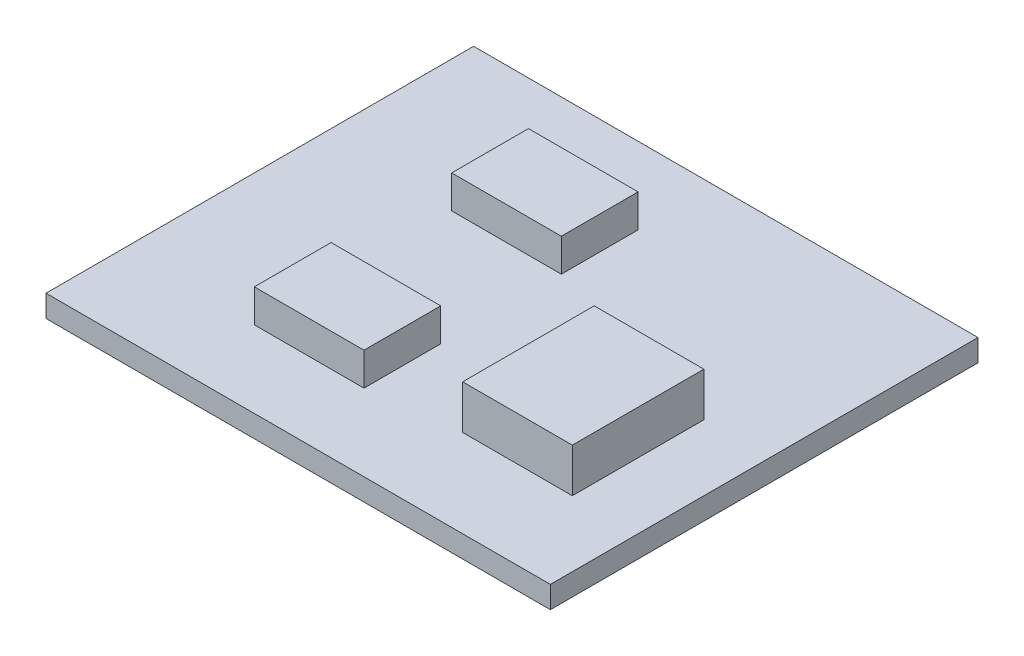
ISO-10303-21;
HEADER;
FILE_DESCRIPTION(('STEP AP214'),'2;1');
FILE_NAME('part.step','',(''),(''),'','','');
FILE_SCHEMA(('AUTOMOTIVE_DESIGN { 1 0 10303 214 1 1 1 1 }'));
ENDSEC;
DATA;
#1=APPLICATION_CONTEXT('core data for automotive mechanical design processes');
#2=APPLICATION_PROTOCOL_DEFINITION('international standard','automotive_design',2000,#1);
#3=PRODUCT_CONTEXT('',#1,'mechanical');
#4=PRODUCT('Part','Part','',(#3));
#5=PRODUCT_RELATED_PRODUCT_CATEGORY('part','',(#4));
#6=PRODUCT_DEFINITION_FORMATION('','',#4);
#7=PRODUCT_DEFINITION_CONTEXT('part definition',#1,'design');
#8=PRODUCT_DEFINITION('design','',#6,#7);
#9=PRODUCT_DEFINITION_SHAPE('','',#8);
#10=(LENGTH_UNIT() NAMED_UNIT(*) SI_UNIT(.MILLI.,.METRE.));
#11=(NAMED_UNIT(*) PLANE_ANGLE_UNIT() SI_UNIT($,.RADIAN.));
#12=(NAMED_UNIT(*) SI_UNIT($,.STERADIAN.) SOLID_ANGLE_UNIT());
#13=UNCERTAINTY_MEASURE_WITH_UNIT(LENGTH_MEASURE(1.E-05),#10,'distance_accuracy_value','');
#14=(GEOMETRIC_REPRESENTATION_CONTEXT(3) GLOBAL_UNCERTAINTY_ASSIGNED_CONTEXT((#13)) GLOBAL_UNIT_ASSIGNED_CONTEXT((#10,
#11,#12)) REPRESENTATION_CONTEXT('',''));
#15=CARTESIAN_POINT('',(0.,0.,0.));
#16=DIRECTION('',(0.,0.,1.));
#17=DIRECTION('',(1.,0.,0.));
#18=AXIS2_PLACEMENT_3D('',#15,#16,#17);
#19=CARTESIAN_POINT('',(0.,0.,0.));
#20=DIRECTION('',(0.,-1.,0.));
#21=DIRECTION('',(0.,0.,-1.));
#22=AXIS2_PLACEMENT_3D('',#19,#20,#21);
#23=PLANE('',#22);
#24=DIRECTION('',(0.,0.,1.));
#25=VECTOR('',#24,1.);
#26=CARTESIAN_POINT('',(6.,0.,-7.));
#27=LINE('',#26,#25);
#28=CARTESIAN_POINT('',(6.,0.,-7.));
#29=VERTEX_POINT('',#28);
#30=CARTESIAN_POINT('',(6.,0.,-3.5));
#31=VERTEX_POINT('',#30);
#32=EDGE_CURVE('E300',#29,#31,#27,.T.);
#33=ORIENTED_EDGE('',*,*,#32,.T.);
#34=DIRECTION('',(1.,0.,0.));
#35=VECTOR('',#34,1.);
#36=CARTESIAN_POINT('',(6.,0.,-3.5));
#37=LINE('',#36,#35);
#38=CARTESIAN_POINT('',(11.,0.,-3.5));
#39=VERTEX_POINT('',#38);
#40=EDGE_CURVE('E305',#31,#39,#37,.T.);
#41=ORIENTED_EDGE('',*,*,#40,.T.);
#42=DIRECTION('',(0.,0.,-1.));
#43=VECTOR('',#42,1.);
#44=CARTESIAN_POINT('',(11.,0.,-7.));
#45=LINE('',#44,#43);
#46=CARTESIAN_POINT('',(11.,0.,-7.));
#47=VERTEX_POINT('',#46);
#48=EDGE_CURVE('E318',#39,#47,#45,.T.);
#49=ORIENTED_EDGE('',*,*,#48,.T.);
#50=DIRECTION('',(-1.,0.,0.));
#51=VECTOR('',#50,1.);
#52=CARTESIAN_POINT('',(6.,0.,-7.));
#53=LINE('',#52,#51);
#54=EDGE_CURVE('E316',#47,#29,#53,.T.);
#55=ORIENTED_EDGE('',*,*,#54,.T.);
#56=EDGE_LOOP('',(#33,#41,#49,#55));
#57=FACE_BOUND('',#56,.T.);
#58=DIRECTION('',(0.,0.,1.));
#59=VECTOR('',#58,1.);
#60=CARTESIAN_POINT('',(6.,0.,-16.));
#61=LINE('',#60,#59);
#62=CARTESIAN_POINT('',(6.,0.,-16.));
#63=VERTEX_POINT('',#62);
#64=CARTESIAN_POINT('',(6.,0.,-12.5));
#65=VERTEX_POINT('',#64);
#66=EDGE_CURVE('E332',#63,#65,#61,.T.);
#67=ORIENTED_EDGE('',*,*,#66,.T.);
#68=DIRECTION('',(1.,0.,0.));
#69=VECTOR('',#68,1.);
#70=CARTESIAN_POINT('',(6.,0.,-12.5));
#71=LINE('',#70,#69);
#72=CARTESIAN_POINT('',(11.,0.,-12.5));
#73=VERTEX_POINT('',#72);
#74=EDGE_CURVE('E337',#65,#73,#71,.T.);
#75=ORIENTED_EDGE('',*,*,#74,.T.);
#76=DIRECTION('',(0.,0.,-1.));
#77=VECTOR('',#76,1.);
#78=CARTESIAN_POINT('',(11.,0.,-16.));
#79=LINE('',#78,#77);
#80=CARTESIAN_POINT('',(11.,0.,-16.));
#81=VERTEX_POINT('',#80);
#82=EDGE_CURVE('E350',#73,#81,#79,.T.);
#83=ORIENTED_EDGE('',*,*,#82,.T.);
#84=DIRECTION('',(-1.,0.,0.));
#85=VECTOR('',#84,1.);
#86=CARTESIAN_POINT('',(6.,0.,-16.));
#87=LINE('',#86,#85);
#88=EDGE_CURVE('E348',#81,#63,#87,.T.);
#89=ORIENTED_EDGE('',*,*,#88,.T.);
#90=EDGE_LOOP('',(#67,#75,#83,#89));
#91=FACE_BOUND('',#90,.T.);
#92=DIRECTION('',(0.,0.,1.));
#93=VECTOR('',#92,1.);
#94=CARTESIAN_POINT('',(0.,0.,0.));
#95=LINE('',#94,#93);
#96=CARTESIAN_POINT('',(0.,0.,-19.5));
#97=VERTEX_POINT('',#96);
#98=CARTESIAN_POINT('',(0.,0.,0.));
#99=VERTEX_POINT('',#98);
#100=EDGE_CURVE('E463',#97,#99,#95,.T.);
#101=ORIENTED_EDGE('',*,*,#100,.F.);
#102=DIRECTION('',(-1.,0.,0.));
#103=VECTOR('',#102,1.);
#104=CARTESIAN_POINT('',(0.,0.,-19.5));
#105=LINE('',#104,#103);
#106=CARTESIAN_POINT('',(23.,0.,-19.5));
#107=VERTEX_POINT('',#106);
#108=EDGE_CURVE('E468',#107,#97,#105,.T.);
#109=ORIENTED_EDGE('',*,*,#108,.F.);
#110=DIRECTION('',(0.,0.,-1.));
#111=VECTOR('',#110,1.);
#112=CARTESIAN_POINT('',(23.,0.,0.));
#113=LINE('',#112,#111);
#114=CARTESIAN_POINT('',(23.,0.,0.));
#115=VERTEX_POINT('',#114);
#116=EDGE_CURVE('E479',#115,#107,#113,.T.);
#117=ORIENTED_EDGE('',*,*,#116,.F.);
#118=DIRECTION('',(1.,0.,0.));
#119=VECTOR('',#118,1.);
#120=CARTESIAN_POINT('',(0.,0.,0.));
#121=LINE('',#120,#119);
#122=EDGE_CURVE('E477',#99,#115,#121,.T.);
#123=ORIENTED_EDGE('',*,*,#122,.F.);
#124=EDGE_LOOP('',(#101,#109,#117,#123));
#125=FACE_BOUND('',#124,.T.);
#126=DIRECTION('',(-1.,0.,0.));
#127=VECTOR('',#126,1.);
#128=CARTESIAN_POINT('',(18.5,0.,-7.5));
#129=LINE('',#128,#127);
#130=CARTESIAN_POINT('',(18.5,0.,-7.5));
#131=VERTEX_POINT('',#130);
#132=CARTESIAN_POINT('',(16.,0.,-7.5));
#133=VERTEX_POINT('',#132);
#134=EDGE_CURVE('E272',#131,#133,#129,.T.);
#135=ORIENTED_EDGE('',*,*,#134,.F.);
#136=DIRECTION('',(0.,0.,1.));
#137=VECTOR('',#136,1.);
#138=CARTESIAN_POINT('',(18.5,0.,-9.));
#139=LINE('',#138,#137);
#140=CARTESIAN_POINT('',(18.5,0.,-9.));
#141=VERTEX_POINT('',#140);
#142=EDGE_CURVE('E269',#141,#131,#139,.T.);
#143=ORIENTED_EDGE('',*,*,#142,.F.);
#144=DIRECTION('',(1.,0.,0.));
#145=VECTOR('',#144,1.);
#146=CARTESIAN_POINT('',(18.5,0.,-9.));
#147=LINE('',#146,#145);
#148=CARTESIAN_POINT('',(16.,0.,-9.));
#149=VERTEX_POINT('',#148);
#150=EDGE_CURVE('E281',#149,#141,#147,.T.);
#151=ORIENTED_EDGE('',*,*,#150,.F.);
#152=DIRECTION('',(0.,0.,-1.));
#153=VECTOR('',#152,1.);
#154=CARTESIAN_POINT('',(16.,0.,-9.));
#155=LINE('',#154,#153);
#156=EDGE_CURVE('E289',#133,#149,#155,.T.);
#157=ORIENTED_EDGE('',*,*,#156,.F.);
#158=EDGE_LOOP('',(#135,#143,#151,#157));
#159=FACE_BOUND('',#158,.T.);
#160=DIRECTION('',(-1.,0.,0.));
#161=VECTOR('',#160,1.);
#162=CARTESIAN_POINT('',(18.5,0.,-4.5));
#163=LINE('',#162,#161);
#164=CARTESIAN_POINT('',(18.5,0.,-4.5));
#165=VERTEX_POINT('',#164);
#166=CARTESIAN_POINT('',(16.,0.,-4.5));
#167=VERTEX_POINT('',#166);
#168=EDGE_CURVE('E907',#165,#167,#163,.T.);
#169=ORIENTED_EDGE('',*,*,#168,.F.);
#170=DIRECTION('',(0.,0.,1.));
#171=VECTOR('',#170,1.);
#172=CARTESIAN_POINT('',(18.5,0.,-6.));
#173=LINE('',#172,#171);
#174=CARTESIAN_POINT('',(18.5,0.,-6.));
#175=VERTEX_POINT('',#174);
#176=EDGE_CURVE('E267',#175,#165,#173,.T.);
#177=ORIENTED_EDGE('',*,*,#176,.F.);
#178=DIRECTION('',(1.,0.,0.));
#179=VECTOR('',#178,1.);
#180=CARTESIAN_POINT('',(18.5,0.,-6.));
#181=LINE('',#180,#179);
#182=CARTESIAN_POINT('',(16.,0.,-6.));
#183=VERTEX_POINT('',#182);
#184=EDGE_CURVE('E263',#183,#175,#181,.T.);
#185=ORIENTED_EDGE('',*,*,#184,.F.);
#186=DIRECTION('',(0.,0.,-1.));
#187=VECTOR('',#186,1.);
#188=CARTESIAN_POINT('',(16.,0.,-6.));
#189=LINE('',#188,#187);
#190=EDGE_CURVE('E904',#167,#183,#189,.T.);
#191=ORIENTED_EDGE('',*,*,#190,.F.);
#192=EDGE_LOOP('',(#169,#177,#185,#191));
#193=FACE_BOUND('',#192,.T.);
#194=ADVANCED_FACE('F34',(#57,#91,#125,#159,#193),#23,.T.);
#195=CARTESIAN_POINT('',(0.,1.,0.));
#196=DIRECTION('',(0.,-1.,0.));
#197=DIRECTION('',(0.,0.,-1.));
#198=AXIS2_PLACEMENT_3D('',#195,#196,#197);
#199=PLANE('',#198);
#200=DIRECTION('',(0.,0.,1.));
#201=VECTOR('',#200,1.);
#202=CARTESIAN_POINT('',(6.,1.,-16.));
#203=LINE('',#202,#201);
#204=CARTESIAN_POINT('',(6.,1.,-16.));
#205=VERTEX_POINT('',#204);
#206=CARTESIAN_POINT('',(6.,1.,-12.5));
#207=VERTEX_POINT('',#206);
#208=EDGE_CURVE('E397',#205,#207,#203,.T.);
#209=ORIENTED_EDGE('',*,*,#208,.F.);
#210=DIRECTION('',(-1.,0.,0.));
#211=VECTOR('',#210,1.);
#212=CARTESIAN_POINT('',(6.,1.,-16.));
#213=LINE('',#212,#211);
#214=CARTESIAN_POINT('',(11.,1.,-16.));
#215=VERTEX_POINT('',#214);
#216=EDGE_CURVE('E402',#215,#205,#213,.T.);
#217=ORIENTED_EDGE('',*,*,#216,.F.);
#218=DIRECTION('',(0.,0.,-1.));
#219=VECTOR('',#218,1.);
#220=CARTESIAN_POINT('',(11.,1.,-16.));
#221=LINE('',#220,#219);
#222=CARTESIAN_POINT('',(11.,1.,-12.5));
#223=VERTEX_POINT('',#222);
#224=EDGE_CURVE('E414',#223,#215,#221,.T.);
#225=ORIENTED_EDGE('',*,*,#224,.F.);
#226=DIRECTION('',(1.,0.,0.));
#227=VECTOR('',#226,1.);
#228=CARTESIAN_POINT('',(6.,1.,-12.5));
#229=LINE('',#228,#227);
#230=EDGE_CURVE('E411',#207,#223,#229,.T.);
#231=ORIENTED_EDGE('',*,*,#230,.F.);
#232=EDGE_LOOP('',(#209,#217,#225,#231));
#233=FACE_BOUND('',#232,.T.);
#234=DIRECTION('',(0.,0.,1.));
#235=VECTOR('',#234,1.);
#236=CARTESIAN_POINT('',(0.,1.,0.));
#237=LINE('',#236,#235);
#238=CARTESIAN_POINT('',(0.,1.,-19.5));
#239=VERTEX_POINT('',#238);
#240=CARTESIAN_POINT('',(0.,1.,0.));
#241=VERTEX_POINT('',#240);
#242=EDGE_CURVE('E464',#239,#241,#237,.T.);
#243=ORIENTED_EDGE('',*,*,#242,.T.);
#244=DIRECTION('',(1.,0.,0.));
#245=VECTOR('',#244,1.);
#246=CARTESIAN_POINT('',(0.,1.,0.));
#247=LINE('',#246,#245);
#248=CARTESIAN_POINT('',(23.,1.,0.));
#249=VERTEX_POINT('',#248);
#250=EDGE_CURVE('E467',#241,#249,#247,.T.);
#251=ORIENTED_EDGE('',*,*,#250,.T.);
#252=DIRECTION('',(0.,0.,-1.));
#253=VECTOR('',#252,1.);
#254=CARTESIAN_POINT('',(23.,1.,0.));
#255=LINE('',#254,#253);
#256=CARTESIAN_POINT('',(23.,1.,-19.5));
#257=VERTEX_POINT('',#256);
#258=EDGE_CURVE('E470',#249,#257,#255,.T.);
#259=ORIENTED_EDGE('',*,*,#258,.T.);
#260=DIRECTION('',(-1.,0.,0.));
#261=VECTOR('',#260,1.);
#262=CARTESIAN_POINT('',(0.,1.,-19.5));
#263=LINE('',#262,#261);
#264=EDGE_CURVE('E472',#257,#239,#263,.T.);
#265=ORIENTED_EDGE('',*,*,#264,.T.);
#266=EDGE_LOOP('',(#243,#251,#259,#265));
#267=FACE_BOUND('',#266,.T.);
#268=DIRECTION('',(0.,0.,1.));
#269=VECTOR('',#268,1.);
#270=CARTESIAN_POINT('',(15.,1.,-10.));
#271=LINE('',#270,#269);
#272=CARTESIAN_POINT('',(15.,1.,-10.));
#273=VERTEX_POINT('',#272);
#274=CARTESIAN_POINT('',(15.,1.,-4.));
#275=VERTEX_POINT('',#274);
#276=EDGE_CURVE('E430',#273,#275,#271,.T.);
#277=ORIENTED_EDGE('',*,*,#276,.F.);
#278=DIRECTION('',(-1.,0.,0.));
#279=VECTOR('',#278,1.);
#280=CARTESIAN_POINT('',(15.,1.,-10.));
#281=LINE('',#280,#279);
#282=CARTESIAN_POINT('',(20.,1.,-10.));
#283=VERTEX_POINT('',#282);
#284=EDGE_CURVE('E435',#283,#273,#281,.T.);
#285=ORIENTED_EDGE('',*,*,#284,.F.);
#286=DIRECTION('',(0.,0.,-1.));
#287=VECTOR('',#286,1.);
#288=CARTESIAN_POINT('',(20.,1.,-10.));
#289=LINE('',#288,#287);
#290=CARTESIAN_POINT('',(20.,1.,-4.));
#291=VERTEX_POINT('',#290);
#292=EDGE_CURVE('E447',#291,#283,#289,.T.);
#293=ORIENTED_EDGE('',*,*,#292,.F.);
#294=DIRECTION('',(1.,0.,0.));
#295=VECTOR('',#294,1.);
#296=CARTESIAN_POINT('',(15.,1.,-4.));
#297=LINE('',#296,#295);
#298=EDGE_CURVE('E444',#275,#291,#297,.T.);
#299=ORIENTED_EDGE('',*,*,#298,.F.);
#300=EDGE_LOOP('',(#277,#285,#293,#299));
#301=FACE_BOUND('',#300,.T.);
#302=DIRECTION('',(0.,0.,1.));
#303=VECTOR('',#302,1.);
#304=CARTESIAN_POINT('',(6.,1.,-7.));
#305=LINE('',#304,#303);
#306=CARTESIAN_POINT('',(6.,1.,-7.));
#307=VERTEX_POINT('',#306);
#308=CARTESIAN_POINT('',(6.,1.,-3.5));
#309=VERTEX_POINT('',#308);
#310=EDGE_CURVE('E364',#307,#309,#305,.T.);
#311=ORIENTED_EDGE('',*,*,#310,.F.);
#312=DIRECTION('',(-1.,0.,0.));
#313=VECTOR('',#312,1.);
#314=CARTESIAN_POINT('',(6.,1.,-7.));
#315=LINE('',#314,#313);
#316=CARTESIAN_POINT('',(11.,1.,-7.));
#317=VERTEX_POINT('',#316);
#318=EDGE_CURVE('E369',#317,#307,#315,.T.);
#319=ORIENTED_EDGE('',*,*,#318,.F.);
#320=DIRECTION('',(0.,0.,-1.));
#321=VECTOR('',#320,1.);
#322=CARTESIAN_POINT('',(11.,1.,-7.));
#323=LINE('',#322,#321);
#324=CARTESIAN_POINT('',(11.,1.,-3.5));
#325=VERTEX_POINT('',#324);
#326=EDGE_CURVE('E381',#325,#317,#323,.T.);
#327=ORIENTED_EDGE('',*,*,#326,.F.);
#328=DIRECTION('',(1.,0.,0.));
#329=VECTOR('',#328,1.);
#330=CARTESIAN_POINT('',(6.,1.,-3.5));
#331=LINE('',#330,#329);
#332=EDGE_CURVE('E378',#309,#325,#331,.T.);
#333=ORIENTED_EDGE('',*,*,#332,.F.);
#334=EDGE_LOOP('',(#311,#319,#327,#333));
#335=FACE_BOUND('',#334,.T.);
#336=ADVANCED_FACE('F506',(#233,#267,#301,#335),#199,.F.);
#337=CARTESIAN_POINT('',(0.,1.,0.));
#338=DIRECTION('',(1.,0.,0.));
#339=DIRECTION('',(0.,0.,-1.));
#340=AXIS2_PLACEMENT_3D('',#337,#338,#339);
#341=PLANE('',#340);
#342=ORIENTED_EDGE('',*,*,#100,.T.);
#343=DIRECTION('',(0.,-1.,0.));
#344=VECTOR('',#343,1.);
#345=CARTESIAN_POINT('',(0.,1.,0.));
#346=LINE('',#345,#344);
#347=EDGE_CURVE('E11',#241,#99,#346,.T.);
#348=ORIENTED_EDGE('',*,*,#347,.F.);
#349=ORIENTED_EDGE('',*,*,#242,.F.);
#350=DIRECTION('',(0.,-1.,0.));
#351=VECTOR('',#350,1.);
#352=CARTESIAN_POINT('',(0.,1.,-19.5));
#353=LINE('',#352,#351);
#354=EDGE_CURVE('E474',#239,#97,#353,.T.);
#355=ORIENTED_EDGE('',*,*,#354,.T.);
#356=EDGE_LOOP('',(#342,#348,#349,#355));
#357=FACE_BOUND('',#356,.T.);
#358=ADVANCED_FACE('F36',(#357),#341,.F.);
#359=CARTESIAN_POINT('',(0.,1.,0.));
#360=DIRECTION('',(0.,0.,-1.));
#361=DIRECTION('',(-1.,0.,0.));
#362=AXIS2_PLACEMENT_3D('',#359,#360,#361);
#363=PLANE('',#362);
#364=ORIENTED_EDGE('',*,*,#122,.T.);
#365=DIRECTION('',(0.,-1.,0.));
#366=VECTOR('',#365,1.);
#367=CARTESIAN_POINT('',(23.,1.,0.));
#368=LINE('',#367,#366);
#369=EDGE_CURVE('E42',#249,#115,#368,.T.);
#370=ORIENTED_EDGE('',*,*,#369,.F.);
#371=ORIENTED_EDGE('',*,*,#250,.F.);
#372=ORIENTED_EDGE('',*,*,#347,.T.);
#373=EDGE_LOOP('',(#364,#370,#371,#372));
#374=FACE_BOUND('',#373,.T.);
#375=ADVANCED_FACE('F508',(#374),#363,.F.);
#376=CARTESIAN_POINT('',(23.,1.,0.));
#377=DIRECTION('',(-1.,0.,0.));
#378=DIRECTION('',(0.,0.,1.));
#379=AXIS2_PLACEMENT_3D('',#376,#377,#378);
#380=PLANE('',#379);
#381=ORIENTED_EDGE('',*,*,#116,.T.);
#382=DIRECTION('',(0.,-1.,0.));
#383=VECTOR('',#382,1.);
#384=CARTESIAN_POINT('',(23.,1.,-19.5));
#385=LINE('',#384,#383);
#386=EDGE_CURVE('E484',#257,#107,#385,.T.);
#387=ORIENTED_EDGE('',*,*,#386,.F.);
#388=ORIENTED_EDGE('',*,*,#258,.F.);
#389=ORIENTED_EDGE('',*,*,#369,.T.);
#390=EDGE_LOOP('',(#381,#387,#388,#389));
#391=FACE_BOUND('',#390,.T.);
#392=ADVANCED_FACE('F491',(#391),#380,.F.);
#393=CARTESIAN_POINT('',(0.,1.,-19.5));
#394=DIRECTION('',(0.,0.,1.));
#395=DIRECTION('',(1.,0.,0.));
#396=AXIS2_PLACEMENT_3D('',#393,#394,#395);
#397=PLANE('',#396);
#398=ORIENTED_EDGE('',*,*,#108,.T.);
#399=ORIENTED_EDGE('',*,*,#354,.F.);
#400=ORIENTED_EDGE('',*,*,#264,.F.);
#401=ORIENTED_EDGE('',*,*,#386,.T.);
#402=EDGE_LOOP('',(#398,#399,#400,#401));
#403=FACE_BOUND('',#402,.T.);
#404=ADVANCED_FACE('F500',(#403),#397,.F.);
#405=CARTESIAN_POINT('',(15.,3.,-10.));
#406=DIRECTION('',(1.,0.,0.));
#407=DIRECTION('',(0.,0.,-1.));
#408=AXIS2_PLACEMENT_3D('',#405,#406,#407);
#409=PLANE('',#408);
#410=ORIENTED_EDGE('',*,*,#276,.T.);
#411=DIRECTION('',(0.,-1.,0.));
#412=VECTOR('',#411,1.);
#413=CARTESIAN_POINT('',(15.,3.,-4.));
#414=LINE('',#413,#412);
#415=CARTESIAN_POINT('',(15.,3.,-4.));
#416=VERTEX_POINT('',#415);
#417=EDGE_CURVE('E460',#416,#275,#414,.T.);
#418=ORIENTED_EDGE('',*,*,#417,.F.);
#419=DIRECTION('',(0.,0.,1.));
#420=VECTOR('',#419,1.);
#421=CARTESIAN_POINT('',(15.,3.,-10.));
#422=LINE('',#421,#420);
#423=CARTESIAN_POINT('',(15.,3.,-10.));
#424=VERTEX_POINT('',#423);
#425=EDGE_CURVE('E431',#424,#416,#422,.T.);
#426=ORIENTED_EDGE('',*,*,#425,.F.);
#427=DIRECTION('',(0.,-1.,0.));
#428=VECTOR('',#427,1.);
#429=CARTESIAN_POINT('',(15.,3.,-10.));
#430=LINE('',#429,#428);
#431=EDGE_CURVE('E441',#424,#273,#430,.T.);
#432=ORIENTED_EDGE('',*,*,#431,.T.);
#433=EDGE_LOOP('',(#410,#418,#426,#432));
#434=FACE_BOUND('',#433,.T.);
#435=ADVANCED_FACE('F527',(#434),#409,.F.);
#436=CARTESIAN_POINT('',(15.,3.,-4.));
#437=DIRECTION('',(0.,0.,-1.));
#438=DIRECTION('',(-1.,0.,0.));
#439=AXIS2_PLACEMENT_3D('',#436,#437,#438);
#440=PLANE('',#439);
#441=ORIENTED_EDGE('',*,*,#298,.T.);
#442=DIRECTION('',(0.,-1.,0.));
#443=VECTOR('',#442,1.);
#444=CARTESIAN_POINT('',(20.,3.,-4.));
#445=LINE('',#444,#443);
#446=CARTESIAN_POINT('',(20.,3.,-4.));
#447=VERTEX_POINT('',#446);
#448=EDGE_CURVE('E457',#447,#291,#445,.T.);
#449=ORIENTED_EDGE('',*,*,#448,.F.);
#450=DIRECTION('',(1.,0.,0.));
#451=VECTOR('',#450,1.);
#452=CARTESIAN_POINT('',(15.,3.,-4.));
#453=LINE('',#452,#451);
#454=EDGE_CURVE('E434',#416,#447,#453,.T.);
#455=ORIENTED_EDGE('',*,*,#454,.F.);
#456=ORIENTED_EDGE('',*,*,#417,.T.);
#457=EDGE_LOOP('',(#441,#449,#455,#456));
#458=FACE_BOUND('',#457,.T.);
#459=ADVANCED_FACE('F531',(#458),#440,.F.);
#460=CARTESIAN_POINT('',(20.,3.,-10.));
#461=DIRECTION('',(-1.,0.,0.));
#462=DIRECTION('',(0.,0.,1.));
#463=AXIS2_PLACEMENT_3D('',#460,#461,#462);
#464=PLANE('',#463);
#465=ORIENTED_EDGE('',*,*,#292,.T.);
#466=DIRECTION('',(0.,-1.,0.));
#467=VECTOR('',#466,1.);
#468=CARTESIAN_POINT('',(20.,3.,-10.));
#469=LINE('',#468,#467);
#470=CARTESIAN_POINT('',(20.,3.,-10.));
#471=VERTEX_POINT('',#470);
#472=EDGE_CURVE('E454',#471,#283,#469,.T.);
#473=ORIENTED_EDGE('',*,*,#472,.F.);
#474=DIRECTION('',(0.,0.,-1.));
#475=VECTOR('',#474,1.);
#476=CARTESIAN_POINT('',(20.,3.,-10.));
#477=LINE('',#476,#475);
#478=EDGE_CURVE('E437',#447,#471,#477,.T.);
#479=ORIENTED_EDGE('',*,*,#478,.F.);
#480=ORIENTED_EDGE('',*,*,#448,.T.);
#481=EDGE_LOOP('',(#465,#473,#479,#480));
#482=FACE_BOUND('',#481,.T.);
#483=ADVANCED_FACE('F536',(#482),#464,.F.);
#484=CARTESIAN_POINT('',(15.,3.,-10.));
#485=DIRECTION('',(0.,0.,1.));
#486=DIRECTION('',(1.,0.,0.));
#487=AXIS2_PLACEMENT_3D('',#484,#485,#486);
#488=PLANE('',#487);
#489=ORIENTED_EDGE('',*,*,#284,.T.);
#490=ORIENTED_EDGE('',*,*,#431,.F.);
#491=DIRECTION('',(-1.,0.,0.));
#492=VECTOR('',#491,1.);
#493=CARTESIAN_POINT('',(15.,3.,-10.));
#494=LINE('',#493,#492);
#495=EDGE_CURVE('E439',#471,#424,#494,.T.);
#496=ORIENTED_EDGE('',*,*,#495,.F.);
#497=ORIENTED_EDGE('',*,*,#472,.T.);
#498=EDGE_LOOP('',(#489,#490,#496,#497));
#499=FACE_BOUND('',#498,.T.);
#500=ADVANCED_FACE('F542',(#499),#488,.F.);
#501=CARTESIAN_POINT('',(0.,3.,0.));
#502=DIRECTION('',(0.,1.,0.));
#503=DIRECTION('',(0.,0.,1.));
#504=AXIS2_PLACEMENT_3D('',#501,#502,#503);
#505=PLANE('',#504);
#506=ORIENTED_EDGE('',*,*,#425,.T.);
#507=ORIENTED_EDGE('',*,*,#454,.T.);
#508=ORIENTED_EDGE('',*,*,#478,.T.);
#509=ORIENTED_EDGE('',*,*,#495,.T.);
#510=EDGE_LOOP('',(#506,#507,#508,#509));
#511=FACE_BOUND('',#510,.T.);
#512=ADVANCED_FACE('F546',(#511),#505,.T.);
#513=CARTESIAN_POINT('',(6.,2.5,-16.));
#514=DIRECTION('',(1.,0.,0.));
#515=DIRECTION('',(0.,0.,-1.));
#516=AXIS2_PLACEMENT_3D('',#513,#514,#515);
#517=PLANE('',#516);
#518=ORIENTED_EDGE('',*,*,#208,.T.);
#519=DIRECTION('',(0.,-1.,0.));
#520=VECTOR('',#519,1.);
#521=CARTESIAN_POINT('',(6.,2.5,-12.5));
#522=LINE('',#521,#520);
#523=CARTESIAN_POINT('',(6.,2.5,-12.5));
#524=VERTEX_POINT('',#523);
#525=EDGE_CURVE('E427',#524,#207,#522,.T.);
#526=ORIENTED_EDGE('',*,*,#525,.F.);
#527=DIRECTION('',(0.,0.,1.));
#528=VECTOR('',#527,1.);
#529=CARTESIAN_POINT('',(6.,2.5,-16.));
#530=LINE('',#529,#528);
#531=CARTESIAN_POINT('',(6.,2.5,-16.));
#532=VERTEX_POINT('',#531);
#533=EDGE_CURVE('E398',#532,#524,#530,.T.);
#534=ORIENTED_EDGE('',*,*,#533,.F.);
#535=DIRECTION('',(0.,-1.,0.));
#536=VECTOR('',#535,1.);
#537=CARTESIAN_POINT('',(6.,2.5,-16.));
#538=LINE('',#537,#536);
#539=EDGE_CURVE('E408',#532,#205,#538,.T.);
#540=ORIENTED_EDGE('',*,*,#539,.T.);
#541=EDGE_LOOP('',(#518,#526,#534,#540));
#542=FACE_BOUND('',#541,.T.);
#543=ADVANCED_FACE('F550',(#542),#517,.F.);
#544=CARTESIAN_POINT('',(6.,2.5,-12.5));
#545=DIRECTION('',(0.,0.,-1.));
#546=DIRECTION('',(-1.,0.,0.));
#547=AXIS2_PLACEMENT_3D('',#544,#545,#546);
#548=PLANE('',#547);
#549=ORIENTED_EDGE('',*,*,#230,.T.);
#550=DIRECTION('',(0.,-1.,0.));
#551=VECTOR('',#550,1.);
#552=CARTESIAN_POINT('',(11.,2.5,-12.5));
#553=LINE('',#552,#551);
#554=CARTESIAN_POINT('',(11.,2.5,-12.5));
#555=VERTEX_POINT('',#554);
#556=EDGE_CURVE('E424',#555,#223,#553,.T.);
#557=ORIENTED_EDGE('',*,*,#556,.F.);
#558=DIRECTION('',(1.,0.,0.));
#559=VECTOR('',#558,1.);
#560=CARTESIAN_POINT('',(6.,2.5,-12.5));
#561=LINE('',#560,#559);
#562=EDGE_CURVE('E401',#524,#555,#561,.T.);
#563=ORIENTED_EDGE('',*,*,#562,.F.);
#564=ORIENTED_EDGE('',*,*,#525,.T.);
#565=EDGE_LOOP('',(#549,#557,#563,#564));
#566=FACE_BOUND('',#565,.T.);
#567=ADVANCED_FACE('F554',(#566),#548,.F.);
#568=CARTESIAN_POINT('',(11.,2.5,-16.));
#569=DIRECTION('',(-1.,0.,0.));
#570=DIRECTION('',(0.,0.,1.));
#571=AXIS2_PLACEMENT_3D('',#568,#569,#570);
#572=PLANE('',#571);
#573=ORIENTED_EDGE('',*,*,#224,.T.);
#574=DIRECTION('',(0.,-1.,0.));
#575=VECTOR('',#574,1.);
#576=CARTESIAN_POINT('',(11.,2.5,-16.));
#577=LINE('',#576,#575);
#578=CARTESIAN_POINT('',(11.,2.5,-16.));
#579=VERTEX_POINT('',#578);
#580=EDGE_CURVE('E421',#579,#215,#577,.T.);
#581=ORIENTED_EDGE('',*,*,#580,.F.);
#582=DIRECTION('',(0.,0.,-1.));
#583=VECTOR('',#582,1.);
#584=CARTESIAN_POINT('',(11.,2.5,-16.));
#585=LINE('',#584,#583);
#586=EDGE_CURVE('E404',#555,#579,#585,.T.);
#587=ORIENTED_EDGE('',*,*,#586,.F.);
#588=ORIENTED_EDGE('',*,*,#556,.T.);
#589=EDGE_LOOP('',(#573,#581,#587,#588));
#590=FACE_BOUND('',#589,.T.);
#591=ADVANCED_FACE('F558',(#590),#572,.F.);
#592=CARTESIAN_POINT('',(6.,2.5,-16.));
#593=DIRECTION('',(0.,0.,1.));
#594=DIRECTION('',(1.,0.,0.));
#595=AXIS2_PLACEMENT_3D('',#592,#593,#594);
#596=PLANE('',#595);
#597=ORIENTED_EDGE('',*,*,#216,.T.);
#598=ORIENTED_EDGE('',*,*,#539,.F.);
#599=DIRECTION('',(-1.,0.,0.));
#600=VECTOR('',#599,1.);
#601=CARTESIAN_POINT('',(6.,2.5,-16.));
#602=LINE('',#601,#600);
#603=EDGE_CURVE('E406',#579,#532,#602,.T.);
#604=ORIENTED_EDGE('',*,*,#603,.F.);
#605=ORIENTED_EDGE('',*,*,#580,.T.);
#606=EDGE_LOOP('',(#597,#598,#604,#605));
#607=FACE_BOUND('',#606,.T.);
#608=ADVANCED_FACE('F562',(#607),#596,.F.);
#609=CARTESIAN_POINT('',(0.,2.5,0.));
#610=DIRECTION('',(0.,1.,0.));
#611=DIRECTION('',(0.,0.,1.));
#612=AXIS2_PLACEMENT_3D('',#609,#610,#611);
#613=PLANE('',#612);
#614=ORIENTED_EDGE('',*,*,#533,.T.);
#615=ORIENTED_EDGE('',*,*,#562,.T.);
#616=ORIENTED_EDGE('',*,*,#586,.T.);
#617=ORIENTED_EDGE('',*,*,#603,.T.);
#618=EDGE_LOOP('',(#614,#615,#616,#617));
#619=FACE_BOUND('',#618,.T.);
#620=ADVANCED_FACE('F566',(#619),#613,.T.);
#621=CARTESIAN_POINT('',(6.,2.5,-7.));
#622=DIRECTION('',(1.,0.,0.));
#623=DIRECTION('',(0.,0.,-1.));
#624=AXIS2_PLACEMENT_3D('',#621,#622,#623);
#625=PLANE('',#624);
#626=ORIENTED_EDGE('',*,*,#310,.T.);
#627=DIRECTION('',(0.,-1.,0.));
#628=VECTOR('',#627,1.);
#629=CARTESIAN_POINT('',(6.,2.5,-3.5));
#630=LINE('',#629,#628);
#631=CARTESIAN_POINT('',(6.,2.5,-3.5));
#632=VERTEX_POINT('',#631);
#633=EDGE_CURVE('E394',#632,#309,#630,.T.);
#634=ORIENTED_EDGE('',*,*,#633,.F.);
#635=DIRECTION('',(0.,0.,1.));
#636=VECTOR('',#635,1.);
#637=CARTESIAN_POINT('',(6.,2.5,-7.));
#638=LINE('',#637,#636);
#639=CARTESIAN_POINT('',(6.,2.5,-7.));
#640=VERTEX_POINT('',#639);
#641=EDGE_CURVE('E365',#640,#632,#638,.T.);
#642=ORIENTED_EDGE('',*,*,#641,.F.);
#643=DIRECTION('',(0.,-1.,0.));
#644=VECTOR('',#643,1.);
#645=CARTESIAN_POINT('',(6.,2.5,-7.));
#646=LINE('',#645,#644);
#647=EDGE_CURVE('E375',#640,#307,#646,.T.);
#648=ORIENTED_EDGE('',*,*,#647,.T.);
#649=EDGE_LOOP('',(#626,#634,#642,#648));
#650=FACE_BOUND('',#649,.T.);
#651=ADVANCED_FACE('F570',(#650),#625,.F.);
#652=CARTESIAN_POINT('',(6.,2.5,-3.5));
#653=DIRECTION('',(0.,0.,-1.));
#654=DIRECTION('',(-1.,0.,0.));
#655=AXIS2_PLACEMENT_3D('',#652,#653,#654);
#656=PLANE('',#655);
#657=ORIENTED_EDGE('',*,*,#332,.T.);
#658=DIRECTION('',(0.,-1.,0.));
#659=VECTOR('',#658,1.);
#660=CARTESIAN_POINT('',(11.,2.5,-3.5));
#661=LINE('',#660,#659);
#662=CARTESIAN_POINT('',(11.,2.5,-3.5));
#663=VERTEX_POINT('',#662);
#664=EDGE_CURVE('E391',#663,#325,#661,.T.);
#665=ORIENTED_EDGE('',*,*,#664,.F.);
#666=DIRECTION('',(1.,0.,0.));
#667=VECTOR('',#666,1.);
#668=CARTESIAN_POINT('',(6.,2.5,-3.5));
#669=LINE('',#668,#667);
#670=EDGE_CURVE('E368',#632,#663,#669,.T.);
#671=ORIENTED_EDGE('',*,*,#670,.F.);
#672=ORIENTED_EDGE('',*,*,#633,.T.);
#673=EDGE_LOOP('',(#657,#665,#671,#672));
#674=FACE_BOUND('',#673,.T.);
#675=ADVANCED_FACE('F574',(#674),#656,.F.);
#676=CARTESIAN_POINT('',(11.,2.5,-7.));
#677=DIRECTION('',(-1.,0.,0.));
#678=DIRECTION('',(0.,0.,1.));
#679=AXIS2_PLACEMENT_3D('',#676,#677,#678);
#680=PLANE('',#679);
#681=ORIENTED_EDGE('',*,*,#326,.T.);
#682=DIRECTION('',(0.,-1.,0.));
#683=VECTOR('',#682,1.);
#684=CARTESIAN_POINT('',(11.,2.5,-7.));
#685=LINE('',#684,#683);
#686=CARTESIAN_POINT('',(11.,2.5,-7.));
#687=VERTEX_POINT('',#686);
#688=EDGE_CURVE('E388',#687,#317,#685,.T.);
#689=ORIENTED_EDGE('',*,*,#688,.F.);
#690=DIRECTION('',(0.,0.,-1.));
#691=VECTOR('',#690,1.);
#692=CARTESIAN_POINT('',(11.,2.5,-7.));
#693=LINE('',#692,#691);
#694=EDGE_CURVE('E371',#663,#687,#693,.T.);
#695=ORIENTED_EDGE('',*,*,#694,.F.);
#696=ORIENTED_EDGE('',*,*,#664,.T.);
#697=EDGE_LOOP('',(#681,#689,#695,#696));
#698=FACE_BOUND('',#697,.T.);
#699=ADVANCED_FACE('F578',(#698),#680,.F.);
#700=CARTESIAN_POINT('',(6.,2.5,-7.));
#701=DIRECTION('',(0.,0.,1.));
#702=DIRECTION('',(1.,0.,0.));
#703=AXIS2_PLACEMENT_3D('',#700,#701,#702);
#704=PLANE('',#703);
#705=ORIENTED_EDGE('',*,*,#318,.T.);
#706=ORIENTED_EDGE('',*,*,#647,.F.);
#707=DIRECTION('',(-1.,0.,0.));
#708=VECTOR('',#707,1.);
#709=CARTESIAN_POINT('',(6.,2.5,-7.));
#710=LINE('',#709,#708);
#711=EDGE_CURVE('E373',#687,#640,#710,.T.);
#712=ORIENTED_EDGE('',*,*,#711,.F.);
#713=ORIENTED_EDGE('',*,*,#688,.T.);
#714=EDGE_LOOP('',(#705,#706,#712,#713));
#715=FACE_BOUND('',#714,.T.);
#716=ADVANCED_FACE('F582',(#715),#704,.F.);
#717=CARTESIAN_POINT('',(0.,2.5,0.));
#718=DIRECTION('',(0.,1.,0.));
#719=DIRECTION('',(0.,0.,1.));
#720=AXIS2_PLACEMENT_3D('',#717,#718,#719);
#721=PLANE('',#720);
#722=ORIENTED_EDGE('',*,*,#641,.T.);
#723=ORIENTED_EDGE('',*,*,#670,.T.);
#724=ORIENTED_EDGE('',*,*,#694,.T.);
#725=ORIENTED_EDGE('',*,*,#711,.T.);
#726=EDGE_LOOP('',(#722,#723,#724,#725));
#727=FACE_BOUND('',#726,.T.);
#728=ADVANCED_FACE('F586',(#727),#721,.T.);
#729=CARTESIAN_POINT('',(6.,-1.5,-16.));
#730=DIRECTION('',(-1.,0.,0.));
#731=DIRECTION('',(0.,0.,1.));
#732=AXIS2_PLACEMENT_3D('',#729,#730,#731);
#733=PLANE('',#732);
#734=ORIENTED_EDGE('',*,*,#66,.F.);
#735=DIRECTION('',(0.,1.,0.));
#736=VECTOR('',#735,1.);
#737=CARTESIAN_POINT('',(6.,-1.5,-16.));
#738=LINE('',#737,#736);
#739=CARTESIAN_POINT('',(6.,-1.5,-16.));
#740=VERTEX_POINT('',#739);
#741=EDGE_CURVE('E361',#740,#63,#738,.T.);
#742=ORIENTED_EDGE('',*,*,#741,.F.);
#743=DIRECTION('',(0.,0.,1.));
#744=VECTOR('',#743,1.);
#745=CARTESIAN_POINT('',(6.,-1.5,-16.));
#746=LINE('',#745,#744);
#747=CARTESIAN_POINT('',(6.,-1.5,-12.5));
#748=VERTEX_POINT('',#747);
#749=EDGE_CURVE('E333',#740,#748,#746,.T.);
#750=ORIENTED_EDGE('',*,*,#749,.T.);
#751=DIRECTION('',(0.,1.,0.));
#752=VECTOR('',#751,1.);
#753=CARTESIAN_POINT('',(6.,-1.5,-12.5));
#754=LINE('',#753,#752);
#755=EDGE_CURVE('E346',#748,#65,#754,.T.);
#756=ORIENTED_EDGE('',*,*,#755,.T.);
#757=EDGE_LOOP('',(#734,#742,#750,#756));
#758=FACE_BOUND('',#757,.T.);
#759=ADVANCED_FACE('F590',(#758),#733,.T.);
#760=CARTESIAN_POINT('',(6.,-1.5,-16.));
#761=DIRECTION('',(0.,0.,-1.));
#762=DIRECTION('',(-1.,0.,0.));
#763=AXIS2_PLACEMENT_3D('',#760,#761,#762);
#764=PLANE('',#763);
#765=ORIENTED_EDGE('',*,*,#88,.F.);
#766=DIRECTION('',(0.,1.,0.));
#767=VECTOR('',#766,1.);
#768=CARTESIAN_POINT('',(11.,-1.5,-16.));
#769=LINE('',#768,#767);
#770=CARTESIAN_POINT('',(11.,-1.5,-16.));
#771=VERTEX_POINT('',#770);
#772=EDGE_CURVE('E358',#771,#81,#769,.T.);
#773=ORIENTED_EDGE('',*,*,#772,.F.);
#774=DIRECTION('',(-1.,0.,0.));
#775=VECTOR('',#774,1.);
#776=CARTESIAN_POINT('',(6.,-1.5,-16.));
#777=LINE('',#776,#775);
#778=EDGE_CURVE('E336',#771,#740,#777,.T.);
#779=ORIENTED_EDGE('',*,*,#778,.T.);
#780=ORIENTED_EDGE('',*,*,#741,.T.);
#781=EDGE_LOOP('',(#765,#773,#779,#780));
#782=FACE_BOUND('',#781,.T.);
#783=ADVANCED_FACE('F594',(#782),#764,.T.);
#784=CARTESIAN_POINT('',(11.,-1.5,-16.));
#785=DIRECTION('',(1.,0.,0.));
#786=DIRECTION('',(0.,0.,-1.));
#787=AXIS2_PLACEMENT_3D('',#784,#785,#786);
#788=PLANE('',#787);
#789=ORIENTED_EDGE('',*,*,#82,.F.);
#790=DIRECTION('',(0.,1.,0.));
#791=VECTOR('',#790,1.);
#792=CARTESIAN_POINT('',(11.,-1.5,-12.5));
#793=LINE('',#792,#791);
#794=CARTESIAN_POINT('',(11.,-1.5,-12.5));
#795=VERTEX_POINT('',#794);
#796=EDGE_CURVE('E355',#795,#73,#793,.T.);
#797=ORIENTED_EDGE('',*,*,#796,.F.);
#798=DIRECTION('',(0.,0.,-1.));
#799=VECTOR('',#798,1.);
#800=CARTESIAN_POINT('',(11.,-1.5,-16.));
#801=LINE('',#800,#799);
#802=EDGE_CURVE('E340',#795,#771,#801,.T.);
#803=ORIENTED_EDGE('',*,*,#802,.T.);
#804=ORIENTED_EDGE('',*,*,#772,.T.);
#805=EDGE_LOOP('',(#789,#797,#803,#804));
#806=FACE_BOUND('',#805,.T.);
#807=ADVANCED_FACE('F598',(#806),#788,.T.);
#808=CARTESIAN_POINT('',(6.,-1.5,-12.5));
#809=DIRECTION('',(0.,0.,1.));
#810=DIRECTION('',(1.,0.,0.));
#811=AXIS2_PLACEMENT_3D('',#808,#809,#810);
#812=PLANE('',#811);
#813=ORIENTED_EDGE('',*,*,#74,.F.);
#814=ORIENTED_EDGE('',*,*,#755,.F.);
#815=DIRECTION('',(1.,0.,0.));
#816=VECTOR('',#815,1.);
#817=CARTESIAN_POINT('',(6.,-1.5,-12.5));
#818=LINE('',#817,#816);
#819=EDGE_CURVE('E343',#748,#795,#818,.T.);
#820=ORIENTED_EDGE('',*,*,#819,.T.);
#821=ORIENTED_EDGE('',*,*,#796,.T.);
#822=EDGE_LOOP('',(#813,#814,#820,#821));
#823=FACE_BOUND('',#822,.T.);
#824=ADVANCED_FACE('F602',(#823),#812,.T.);
#825=CARTESIAN_POINT('',(0.,-1.5,0.));
#826=DIRECTION('',(0.,-1.,0.));
#827=DIRECTION('',(0.,0.,1.));
#828=AXIS2_PLACEMENT_3D('',#825,#826,#827);
#829=PLANE('',#828);
#830=ORIENTED_EDGE('',*,*,#749,.F.);
#831=ORIENTED_EDGE('',*,*,#778,.F.);
#832=ORIENTED_EDGE('',*,*,#802,.F.);
#833=ORIENTED_EDGE('',*,*,#819,.F.);
#834=EDGE_LOOP('',(#830,#831,#832,#833));
#835=FACE_BOUND('',#834,.T.);
#836=ADVANCED_FACE('F606',(#835),#829,.T.);
#837=CARTESIAN_POINT('',(6.,-1.5,-7.));
#838=DIRECTION('',(-1.,0.,0.));
#839=DIRECTION('',(0.,0.,1.));
#840=AXIS2_PLACEMENT_3D('',#837,#838,#839);
#841=PLANE('',#840);
#842=ORIENTED_EDGE('',*,*,#32,.F.);
#843=DIRECTION('',(0.,1.,0.));
#844=VECTOR('',#843,1.);
#845=CARTESIAN_POINT('',(6.,-1.5,-7.));
#846=LINE('',#845,#844);
#847=CARTESIAN_POINT('',(6.,-1.5,-7.));
#848=VERTEX_POINT('',#847);
#849=EDGE_CURVE('E329',#848,#29,#846,.T.);
#850=ORIENTED_EDGE('',*,*,#849,.F.);
#851=DIRECTION('',(0.,0.,1.));
#852=VECTOR('',#851,1.);
#853=CARTESIAN_POINT('',(6.,-1.5,-7.));
#854=LINE('',#853,#852);
#855=CARTESIAN_POINT('',(6.,-1.5,-3.5));
#856=VERTEX_POINT('',#855);
#857=EDGE_CURVE('E301',#848,#856,#854,.T.);
#858=ORIENTED_EDGE('',*,*,#857,.T.);
#859=DIRECTION('',(0.,1.,0.));
#860=VECTOR('',#859,1.);
#861=CARTESIAN_POINT('',(6.,-1.5,-3.5));
#862=LINE('',#861,#860);
#863=EDGE_CURVE('E314',#856,#31,#862,.T.);
#864=ORIENTED_EDGE('',*,*,#863,.T.);
#865=EDGE_LOOP('',(#842,#850,#858,#864));
#866=FACE_BOUND('',#865,.T.);
#867=ADVANCED_FACE('F610',(#866),#841,.T.);
#868=CARTESIAN_POINT('',(6.,-1.5,-7.));
#869=DIRECTION('',(0.,0.,-1.));
#870=DIRECTION('',(-1.,0.,0.));
#871=AXIS2_PLACEMENT_3D('',#868,#869,#870);
#872=PLANE('',#871);
#873=ORIENTED_EDGE('',*,*,#54,.F.);
#874=DIRECTION('',(0.,1.,0.));
#875=VECTOR('',#874,1.);
#876=CARTESIAN_POINT('',(11.,-1.5,-7.));
#877=LINE('',#876,#875);
#878=CARTESIAN_POINT('',(11.,-1.5,-7.));
#879=VERTEX_POINT('',#878);
#880=EDGE_CURVE('E326',#879,#47,#877,.T.);
#881=ORIENTED_EDGE('',*,*,#880,.F.);
#882=DIRECTION('',(-1.,0.,0.));
#883=VECTOR('',#882,1.);
#884=CARTESIAN_POINT('',(6.,-1.5,-7.));
#885=LINE('',#884,#883);
#886=EDGE_CURVE('E304',#879,#848,#885,.T.);
#887=ORIENTED_EDGE('',*,*,#886,.T.);
#888=ORIENTED_EDGE('',*,*,#849,.T.);
#889=EDGE_LOOP('',(#873,#881,#887,#888));
#890=FACE_BOUND('',#889,.T.);
#891=ADVANCED_FACE('F614',(#890),#872,.T.);
#892=CARTESIAN_POINT('',(11.,-1.5,-7.));
#893=DIRECTION('',(1.,0.,0.));
#894=DIRECTION('',(0.,0.,-1.));
#895=AXIS2_PLACEMENT_3D('',#892,#893,#894);
#896=PLANE('',#895);
#897=ORIENTED_EDGE('',*,*,#48,.F.);
#898=DIRECTION('',(0.,1.,0.));
#899=VECTOR('',#898,1.);
#900=CARTESIAN_POINT('',(11.,-1.5,-3.5));
#901=LINE('',#900,#899);
#902=CARTESIAN_POINT('',(11.,-1.5,-3.5));
#903=VERTEX_POINT('',#902);
#904=EDGE_CURVE('E323',#903,#39,#901,.T.);
#905=ORIENTED_EDGE('',*,*,#904,.F.);
#906=DIRECTION('',(0.,0.,-1.));
#907=VECTOR('',#906,1.);
#908=CARTESIAN_POINT('',(11.,-1.5,-7.));
#909=LINE('',#908,#907);
#910=EDGE_CURVE('E308',#903,#879,#909,.T.);
#911=ORIENTED_EDGE('',*,*,#910,.T.);
#912=ORIENTED_EDGE('',*,*,#880,.T.);
#913=EDGE_LOOP('',(#897,#905,#911,#912));
#914=FACE_BOUND('',#913,.T.);
#915=ADVANCED_FACE('F618',(#914),#896,.T.);
#916=CARTESIAN_POINT('',(6.,-1.5,-3.5));
#917=DIRECTION('',(0.,0.,1.));
#918=DIRECTION('',(1.,0.,0.));
#919=AXIS2_PLACEMENT_3D('',#916,#917,#918);
#920=PLANE('',#919);
#921=ORIENTED_EDGE('',*,*,#40,.F.);
#922=ORIENTED_EDGE('',*,*,#863,.F.);
#923=DIRECTION('',(1.,0.,0.));
#924=VECTOR('',#923,1.);
#925=CARTESIAN_POINT('',(6.,-1.5,-3.5));
#926=LINE('',#925,#924);
#927=EDGE_CURVE('E311',#856,#903,#926,.T.);
#928=ORIENTED_EDGE('',*,*,#927,.T.);
#929=ORIENTED_EDGE('',*,*,#904,.T.);
#930=EDGE_LOOP('',(#921,#922,#928,#929));
#931=FACE_BOUND('',#930,.T.);
#932=ADVANCED_FACE('F622',(#931),#920,.T.);
#933=CARTESIAN_POINT('',(0.,-1.5,0.));
#934=DIRECTION('',(0.,-1.,0.));
#935=DIRECTION('',(0.,0.,1.));
#936=AXIS2_PLACEMENT_3D('',#933,#934,#935);
#937=PLANE('',#936);
#938=ORIENTED_EDGE('',*,*,#857,.F.);
#939=ORIENTED_EDGE('',*,*,#886,.F.);
#940=ORIENTED_EDGE('',*,*,#910,.F.);
#941=ORIENTED_EDGE('',*,*,#927,.F.);
#942=EDGE_LOOP('',(#938,#939,#940,#941));
#943=FACE_BOUND('',#942,.T.);
#944=ADVANCED_FACE('F626',(#943),#937,.T.);
#945=CARTESIAN_POINT('',(18.5,-2.,-9.));
#946=DIRECTION('',(-1.,0.,0.));
#947=DIRECTION('',(0.,0.,1.));
#948=AXIS2_PLACEMENT_3D('',#945,#946,#947);
#949=PLANE('',#948);
#950=ORIENTED_EDGE('',*,*,#142,.T.);
#951=DIRECTION('',(0.,1.,0.));
#952=VECTOR('',#951,1.);
#953=CARTESIAN_POINT('',(18.5,-2.,-7.5));
#954=LINE('',#953,#952);
#955=CARTESIAN_POINT('',(18.5,-2.,-7.5));
#956=VERTEX_POINT('',#955);
#957=EDGE_CURVE('E298',#956,#131,#954,.T.);
#958=ORIENTED_EDGE('',*,*,#957,.F.);
#959=DIRECTION('',(0.,0.,1.));
#960=VECTOR('',#959,1.);
#961=CARTESIAN_POINT('',(18.5,-2.,-9.));
#962=LINE('',#961,#960);
#963=CARTESIAN_POINT('',(18.5,-2.,-9.));
#964=VERTEX_POINT('',#963);
#965=EDGE_CURVE('E277',#964,#956,#962,.T.);
#966=ORIENTED_EDGE('',*,*,#965,.F.);
#967=DIRECTION('',(0.,1.,0.));
#968=VECTOR('',#967,1.);
#969=CARTESIAN_POINT('',(18.5,-2.,-9.));
#970=LINE('',#969,#968);
#971=EDGE_CURVE('E286',#964,#141,#970,.T.);
#972=ORIENTED_EDGE('',*,*,#971,.T.);
#973=EDGE_LOOP('',(#950,#958,#966,#972));
#974=FACE_BOUND('',#973,.T.);
#975=ADVANCED_FACE('F630',(#974),#949,.F.);
#976=CARTESIAN_POINT('',(18.5,-2.,-7.5));
#977=DIRECTION('',(0.,0.,-1.));
#978=DIRECTION('',(-1.,0.,0.));
#979=AXIS2_PLACEMENT_3D('',#976,#977,#978);
#980=PLANE('',#979);
#981=ORIENTED_EDGE('',*,*,#134,.T.);
#982=DIRECTION('',(0.,1.,0.));
#983=VECTOR('',#982,1.);
#984=CARTESIAN_POINT('',(16.,-2.,-7.5));
#985=LINE('',#984,#983);
#986=CARTESIAN_POINT('',(16.,-2.,-7.5));
#987=VERTEX_POINT('',#986);
#988=EDGE_CURVE('E295',#987,#133,#985,.T.);
#989=ORIENTED_EDGE('',*,*,#988,.F.);
#990=DIRECTION('',(-1.,0.,0.));
#991=VECTOR('',#990,1.);
#992=CARTESIAN_POINT('',(18.5,-2.,-7.5));
#993=LINE('',#992,#991);
#994=EDGE_CURVE('E280',#956,#987,#993,.T.);
#995=ORIENTED_EDGE('',*,*,#994,.F.);
#996=ORIENTED_EDGE('',*,*,#957,.T.);
#997=EDGE_LOOP('',(#981,#989,#995,#996));
#998=FACE_BOUND('',#997,.T.);
#999=ADVANCED_FACE('F634',(#998),#980,.F.);
#1000=CARTESIAN_POINT('',(16.,-2.,-9.));
#1001=DIRECTION('',(1.,0.,0.));
#1002=DIRECTION('',(0.,0.,-1.));
#1003=AXIS2_PLACEMENT_3D('',#1000,#1001,#1002);
#1004=PLANE('',#1003);
#1005=ORIENTED_EDGE('',*,*,#156,.T.);
#1006=DIRECTION('',(0.,1.,0.));
#1007=VECTOR('',#1006,1.);
#1008=CARTESIAN_POINT('',(16.,-2.,-9.));
#1009=LINE('',#1008,#1007);
#1010=CARTESIAN_POINT('',(16.,-2.,-9.));
#1011=VERTEX_POINT('',#1010);
#1012=EDGE_CURVE('E57',#1011,#149,#1009,.T.);
#1013=ORIENTED_EDGE('',*,*,#1012,.F.);
#1014=DIRECTION('',(0.,0.,-1.));
#1015=VECTOR('',#1014,1.);
#1016=CARTESIAN_POINT('',(16.,-2.,-9.));
#1017=LINE('',#1016,#1015);
#1018=EDGE_CURVE('E283',#987,#1011,#1017,.T.);
#1019=ORIENTED_EDGE('',*,*,#1018,.F.);
#1020=ORIENTED_EDGE('',*,*,#988,.T.);
#1021=EDGE_LOOP('',(#1005,#1013,#1019,#1020));
#1022=FACE_BOUND('',#1021,.T.);
#1023=ADVANCED_FACE('F638',(#1022),#1004,.F.);
#1024=CARTESIAN_POINT('',(18.5,-2.,-9.));
#1025=DIRECTION('',(0.,0.,1.));
#1026=DIRECTION('',(1.,0.,0.));
#1027=AXIS2_PLACEMENT_3D('',#1024,#1025,#1026);
#1028=PLANE('',#1027);
#1029=ORIENTED_EDGE('',*,*,#150,.T.);
#1030=ORIENTED_EDGE('',*,*,#971,.F.);
#1031=DIRECTION('',(1.,0.,0.));
#1032=VECTOR('',#1031,1.);
#1033=CARTESIAN_POINT('',(18.5,-2.,-9.));
#1034=LINE('',#1033,#1032);
#1035=EDGE_CURVE('E285',#1011,#964,#1034,.T.);
#1036=ORIENTED_EDGE('',*,*,#1035,.F.);
#1037=ORIENTED_EDGE('',*,*,#1012,.T.);
#1038=EDGE_LOOP('',(#1029,#1030,#1036,#1037));
#1039=FACE_BOUND('',#1038,.T.);
#1040=ADVANCED_FACE('F642',(#1039),#1028,.F.);
#1041=CARTESIAN_POINT('',(0.,-2.,0.));
#1042=DIRECTION('',(0.,-1.,0.));
#1043=DIRECTION('',(0.,0.,-1.));
#1044=AXIS2_PLACEMENT_3D('',#1041,#1042,#1043);
#1045=PLANE('',#1044);
#1046=ORIENTED_EDGE('',*,*,#965,.T.);
#1047=ORIENTED_EDGE('',*,*,#994,.T.);
#1048=ORIENTED_EDGE('',*,*,#1018,.T.);
#1049=ORIENTED_EDGE('',*,*,#1035,.T.);
#1050=EDGE_LOOP('',(#1046,#1047,#1048,#1049));
#1051=FACE_BOUND('',#1050,.T.);
#1052=ADVANCED_FACE('F646',(#1051),#1045,.T.);
#1053=CARTESIAN_POINT('',(18.5,-2.,-6.));
#1054=DIRECTION('',(-1.,0.,0.));
#1055=DIRECTION('',(0.,0.,1.));
#1056=AXIS2_PLACEMENT_3D('',#1053,#1054,#1055);
#1057=PLANE('',#1056);
#1058=ORIENTED_EDGE('',*,*,#176,.T.);
#1059=DIRECTION('',(0.,1.,0.));
#1060=VECTOR('',#1059,1.);
#1061=CARTESIAN_POINT('',(18.5,-2.,-4.5));
#1062=LINE('',#1061,#1060);
#1063=CARTESIAN_POINT('',(18.5,-2.,-4.5));
#1064=VERTEX_POINT('',#1063);
#1065=EDGE_CURVE('E248',#1064,#165,#1062,.T.);
#1066=ORIENTED_EDGE('',*,*,#1065,.F.);
#1067=DIRECTION('',(0.,0.,1.));
#1068=VECTOR('',#1067,1.);
#1069=CARTESIAN_POINT('',(18.5,-2.,-6.));
#1070=LINE('',#1069,#1068);
#1071=CARTESIAN_POINT('',(18.5,-2.,-6.));
#1072=VERTEX_POINT('',#1071);
#1073=EDGE_CURVE('E255',#1072,#1064,#1070,.T.);
#1074=ORIENTED_EDGE('',*,*,#1073,.F.);
#1075=DIRECTION('',(0.,1.,0.));
#1076=VECTOR('',#1075,1.);
#1077=CARTESIAN_POINT('',(18.5,-2.,-6.));
#1078=LINE('',#1077,#1076);
#1079=EDGE_CURVE('E901',#1072,#175,#1078,.T.);
#1080=ORIENTED_EDGE('',*,*,#1079,.T.);
#1081=EDGE_LOOP('',(#1058,#1066,#1074,#1080));
#1082=FACE_BOUND('',#1081,.T.);
#1083=ADVANCED_FACE('F265',(#1082),#1057,.F.);
#1084=CARTESIAN_POINT('',(18.5,-2.,-4.5));
#1085=DIRECTION('',(0.,0.,-1.));
#1086=DIRECTION('',(-1.,0.,0.));
#1087=AXIS2_PLACEMENT_3D('',#1084,#1085,#1086);
#1088=PLANE('',#1087);
#1089=ORIENTED_EDGE('',*,*,#168,.T.);
#1090=DIRECTION('',(0.,1.,0.));
#1091=VECTOR('',#1090,1.);
#1092=CARTESIAN_POINT('',(16.,-2.,-4.5));
#1093=LINE('',#1092,#1091);
#1094=CARTESIAN_POINT('',(16.,-2.,-4.5));
#1095=VERTEX_POINT('',#1094);
#1096=EDGE_CURVE('E251',#1095,#167,#1093,.T.);
#1097=ORIENTED_EDGE('',*,*,#1096,.F.);
#1098=DIRECTION('',(-1.,0.,0.));
#1099=VECTOR('',#1098,1.);
#1100=CARTESIAN_POINT('',(18.5,-2.,-4.5));
#1101=LINE('',#1100,#1099);
#1102=EDGE_CURVE('E244',#1064,#1095,#1101,.T.);
#1103=ORIENTED_EDGE('',*,*,#1102,.F.);
#1104=ORIENTED_EDGE('',*,*,#1065,.T.);
#1105=EDGE_LOOP('',(#1089,#1097,#1103,#1104));
#1106=FACE_BOUND('',#1105,.T.);
#1107=ADVANCED_FACE('F246',(#1106),#1088,.F.);
#1108=CARTESIAN_POINT('',(16.,-2.,-6.));
#1109=DIRECTION('',(1.,0.,0.));
#1110=DIRECTION('',(0.,0.,-1.));
#1111=AXIS2_PLACEMENT_3D('',#1108,#1109,#1110);
#1112=PLANE('',#1111);
#1113=ORIENTED_EDGE('',*,*,#190,.T.);
#1114=DIRECTION('',(0.,1.,0.));
#1115=VECTOR('',#1114,1.);
#1116=CARTESIAN_POINT('',(16.,-2.,-6.));
#1117=LINE('',#1116,#1115);
#1118=CARTESIAN_POINT('',(16.,-2.,-6.));
#1119=VERTEX_POINT('',#1118);
#1120=EDGE_CURVE('E49',#1119,#183,#1117,.T.);
#1121=ORIENTED_EDGE('',*,*,#1120,.F.);
#1122=DIRECTION('',(0.,0.,-1.));
#1123=VECTOR('',#1122,1.);
#1124=CARTESIAN_POINT('',(16.,-2.,-6.));
#1125=LINE('',#1124,#1123);
#1126=EDGE_CURVE('E254',#1095,#1119,#1125,.T.);
#1127=ORIENTED_EDGE('',*,*,#1126,.F.);
#1128=ORIENTED_EDGE('',*,*,#1096,.T.);
#1129=EDGE_LOOP('',(#1113,#1121,#1127,#1128));
#1130=FACE_BOUND('',#1129,.T.);
#1131=ADVANCED_FACE('F654',(#1130),#1112,.F.);
#1132=CARTESIAN_POINT('',(18.5,-2.,-6.));
#1133=DIRECTION('',(0.,0.,1.));
#1134=DIRECTION('',(1.,0.,0.));
#1135=AXIS2_PLACEMENT_3D('',#1132,#1133,#1134);
#1136=PLANE('',#1135);
#1137=ORIENTED_EDGE('',*,*,#184,.T.);
#1138=ORIENTED_EDGE('',*,*,#1079,.F.);
#1139=DIRECTION('',(1.,0.,0.));
#1140=VECTOR('',#1139,1.);
#1141=CARTESIAN_POINT('',(18.5,-2.,-6.));
#1142=LINE('',#1141,#1140);
#1143=EDGE_CURVE('E259',#1119,#1072,#1142,.T.);
#1144=ORIENTED_EDGE('',*,*,#1143,.F.);
#1145=ORIENTED_EDGE('',*,*,#1120,.T.);
#1146=EDGE_LOOP('',(#1137,#1138,#1144,#1145));
#1147=FACE_BOUND('',#1146,.T.);
#1148=ADVANCED_FACE('F657',(#1147),#1136,.F.);
#1149=CARTESIAN_POINT('',(0.,-2.,0.));
#1150=DIRECTION('',(0.,-1.,0.));
#1151=DIRECTION('',(0.,0.,-1.));
#1152=AXIS2_PLACEMENT_3D('',#1149,#1150,#1151);
#1153=PLANE('',#1152);
#1154=ORIENTED_EDGE('',*,*,#1073,.T.);
#1155=ORIENTED_EDGE('',*,*,#1102,.T.);
#1156=ORIENTED_EDGE('',*,*,#1126,.T.);
#1157=ORIENTED_EDGE('',*,*,#1143,.T.);
#1158=EDGE_LOOP('',(#1154,#1155,#1156,#1157));
#1159=FACE_BOUND('',#1158,.T.);
#1160=ADVANCED_FACE('F258',(#1159),#1153,.T.);
#1161=CLOSED_SHELL('',(#194,#336,#358,#375,#392,#404,#435,#459,#483,#500,#512,#543,#567,#591,
#608,#620,#651,#675,#699,#716,#728,#759,#783,#807,#824,#836,#867,#891,#915,#932,#944,#975,#999,
#1023,#1040,#1052,#1083,#1107,#1131,#1148,#1160));
#1162=MANIFOLD_SOLID_BREP('B2',#1161);
#1163=ADVANCED_BREP_SHAPE_REPRESENTATION('',(#18,#1162),#14);
#1164=SHAPE_DEFINITION_REPRESENTATION(#9,#1163);
ENDSEC;
END-ISO-10303-21;
